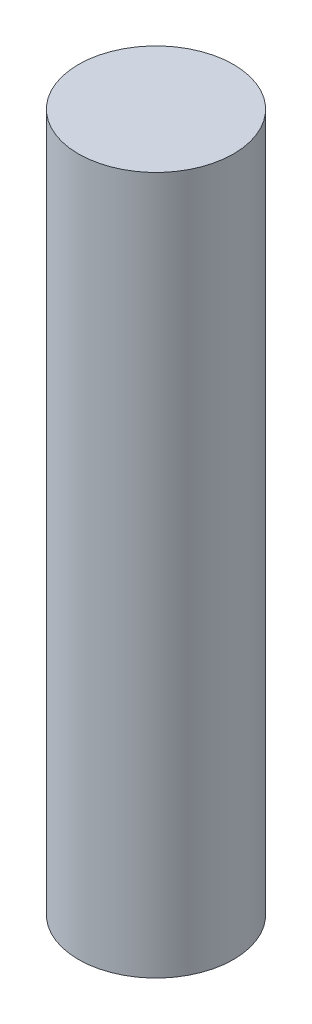
ISO-10303-21;
HEADER;
FILE_DESCRIPTION(('STEP AP214'),'2;1');
FILE_NAME('part.step','',(''),(''),'','','');
FILE_SCHEMA(('AUTOMOTIVE_DESIGN { 1 0 10303 214 1 1 1 1 }'));
ENDSEC;
DATA;
#1=APPLICATION_CONTEXT('core data for automotive mechanical design processes');
#2=APPLICATION_PROTOCOL_DEFINITION('international standard','automotive_design',2000,#1);
#3=PRODUCT_CONTEXT('',#1,'mechanical');
#4=PRODUCT('Part','Part','',(#3));
#5=PRODUCT_RELATED_PRODUCT_CATEGORY('part','',(#4));
#6=PRODUCT_DEFINITION_FORMATION('','',#4);
#7=PRODUCT_DEFINITION_CONTEXT('part definition',#1,'design');
#8=PRODUCT_DEFINITION('design','',#6,#7);
#9=PRODUCT_DEFINITION_SHAPE('','',#8);
#10=(LENGTH_UNIT() NAMED_UNIT(*) SI_UNIT(.MILLI.,.METRE.));
#11=(NAMED_UNIT(*) PLANE_ANGLE_UNIT() SI_UNIT($,.RADIAN.));
#12=(NAMED_UNIT(*) SI_UNIT($,.STERADIAN.) SOLID_ANGLE_UNIT());
#13=UNCERTAINTY_MEASURE_WITH_UNIT(LENGTH_MEASURE(1.E-05),#10,'distance_accuracy_value','');
#14=(GEOMETRIC_REPRESENTATION_CONTEXT(3) GLOBAL_UNCERTAINTY_ASSIGNED_CONTEXT((#13)) GLOBAL_UNIT_ASSIGNED_CONTEXT((#10,
#11,#12)) REPRESENTATION_CONTEXT('',''));
#15=CARTESIAN_POINT('',(0.,0.,0.));
#16=DIRECTION('',(0.,0.,1.));
#17=DIRECTION('',(1.,0.,0.));
#18=AXIS2_PLACEMENT_3D('',#15,#16,#17);
#19=CARTESIAN_POINT('',(0.,27.,0.));
#20=DIRECTION('',(0.,-1.,0.));
#21=DIRECTION('',(0.,0.,-1.));
#22=AXIS2_PLACEMENT_3D('',#19,#20,#21);
#23=CYLINDRICAL_SURFACE('',#22,3.);
#24=CARTESIAN_POINT('',(0.,27.,0.));
#25=DIRECTION('',(0.,1.,0.));
#26=DIRECTION('',(0.,0.,1.));
#27=AXIS2_PLACEMENT_3D('',#24,#25,#26);
#28=CIRCLE('',#27,3.);
#29=CARTESIAN_POINT('',(0.,27.,3.));
#30=VERTEX_POINT('',#29);
#31=EDGE_CURVE('E10',#30,#30,#28,.T.);
#32=ORIENTED_EDGE('',*,*,#31,.F.);
#33=EDGE_LOOP('',(#32));
#34=FACE_BOUND('',#33,.T.);
#35=CARTESIAN_POINT('',(0.,0.,0.));
#36=DIRECTION('',(0.,1.,0.));
#37=DIRECTION('',(0.,0.,1.));
#38=AXIS2_PLACEMENT_3D('',#35,#36,#37);
#39=CIRCLE('',#38,3.);
#40=CARTESIAN_POINT('',(0.,0.,3.));
#41=VERTEX_POINT('',#40);
#42=EDGE_CURVE('E34',#41,#41,#39,.T.);
#43=ORIENTED_EDGE('',*,*,#42,.T.);
#44=EDGE_LOOP('',(#43));
#45=FACE_BOUND('',#44,.T.);
#46=ADVANCED_FACE('F31',(#34,#45),#23,.T.);
#47=CARTESIAN_POINT('',(0.,27.,0.));
#48=DIRECTION('',(0.,1.,0.));
#49=DIRECTION('',(0.,0.,1.));
#50=AXIS2_PLACEMENT_3D('',#47,#48,#49);
#51=PLANE('',#50);
#52=ORIENTED_EDGE('',*,*,#31,.T.);
#53=EDGE_LOOP('',(#52));
#54=FACE_BOUND('',#53,.T.);
#55=ADVANCED_FACE('F46',(#54),#51,.T.);
#56=CARTESIAN_POINT('',(0.,0.,0.));
#57=DIRECTION('',(0.,1.,0.));
#58=DIRECTION('',(0.,0.,1.));
#59=AXIS2_PLACEMENT_3D('',#56,#57,#58);
#60=PLANE('',#59);
#61=ORIENTED_EDGE('',*,*,#42,.F.);
#62=EDGE_LOOP('',(#61));
#63=FACE_BOUND('',#62,.T.);
#64=ADVANCED_FACE('F44',(#63),#60,.F.);
#65=CLOSED_SHELL('',(#46,#55,#64));
#66=MANIFOLD_SOLID_BREP('B2',#65);
#67=ADVANCED_BREP_SHAPE_REPRESENTATION('',(#18,#66),#14);
#68=SHAPE_DEFINITION_REPRESENTATION(#9,#67);
ENDSEC;
END-ISO-10303-21;
